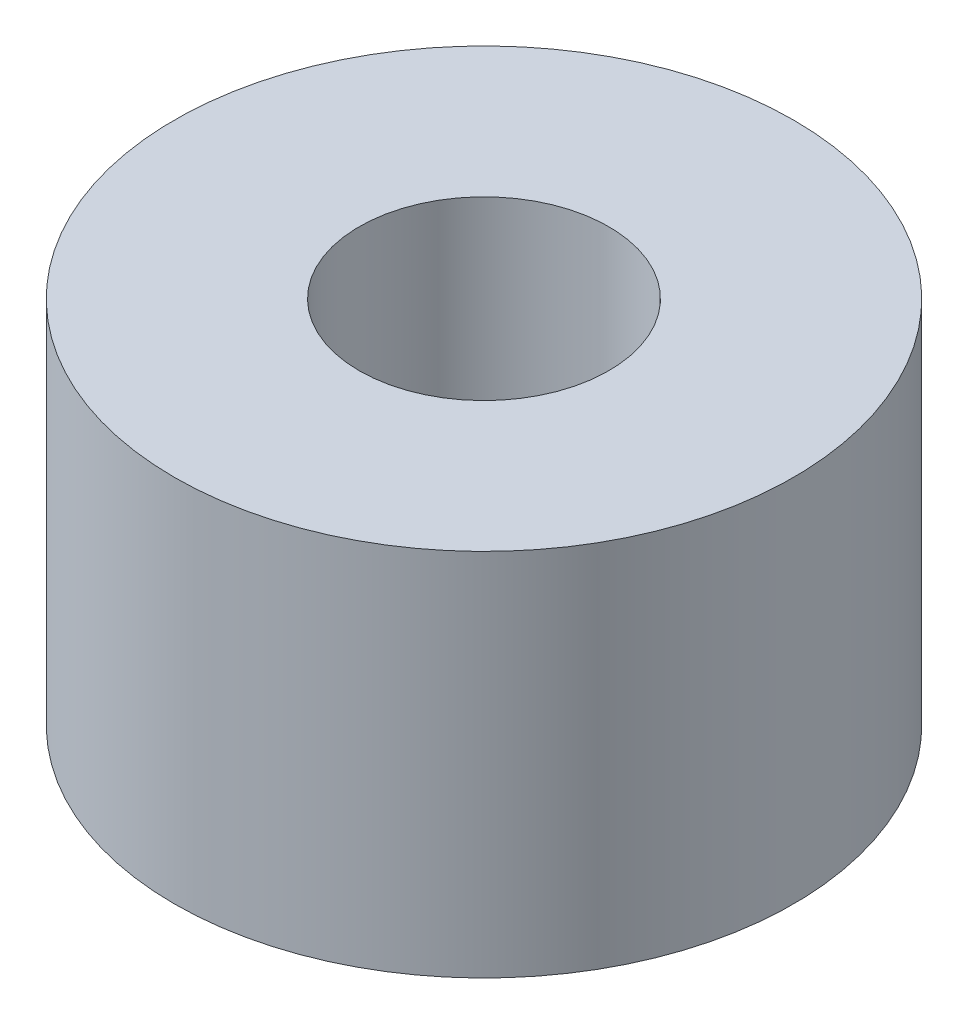
ISO-10303-21;
HEADER;
FILE_DESCRIPTION(('STEP AP214'),'2;1');
FILE_NAME('part.step','',(''),(''),'','','');
FILE_SCHEMA(('AUTOMOTIVE_DESIGN { 1 0 10303 214 1 1 1 1 }'));
ENDSEC;
DATA;
#1=APPLICATION_CONTEXT('core data for automotive mechanical design processes');
#2=APPLICATION_PROTOCOL_DEFINITION('international standard','automotive_design',2000,#1);
#3=PRODUCT_CONTEXT('',#1,'mechanical');
#4=PRODUCT('Part','Part','',(#3));
#5=PRODUCT_RELATED_PRODUCT_CATEGORY('part','',(#4));
#6=PRODUCT_DEFINITION_FORMATION('','',#4);
#7=PRODUCT_DEFINITION_CONTEXT('part definition',#1,'design');
#8=PRODUCT_DEFINITION('design','',#6,#7);
#9=PRODUCT_DEFINITION_SHAPE('','',#8);
#10=(LENGTH_UNIT() NAMED_UNIT(*) SI_UNIT(.MILLI.,.METRE.));
#11=(NAMED_UNIT(*) PLANE_ANGLE_UNIT() SI_UNIT($,.RADIAN.));
#12=(NAMED_UNIT(*) SI_UNIT($,.STERADIAN.) SOLID_ANGLE_UNIT());
#13=UNCERTAINTY_MEASURE_WITH_UNIT(LENGTH_MEASURE(1.E-05),#10,'distance_accuracy_value','');
#14=(GEOMETRIC_REPRESENTATION_CONTEXT(3) GLOBAL_UNCERTAINTY_ASSIGNED_CONTEXT((#13)) GLOBAL_UNIT_ASSIGNED_CONTEXT((#10,
#11,#12)) REPRESENTATION_CONTEXT('',''));
#15=CARTESIAN_POINT('',(0.,0.,0.));
#16=DIRECTION('',(0.,0.,1.));
#17=DIRECTION('',(1.,0.,0.));
#18=AXIS2_PLACEMENT_3D('',#15,#16,#17);
#19=CARTESIAN_POINT('',(0.,10.,0.));
#20=DIRECTION('',(0.,1.,0.));
#21=DIRECTION('',(0.,0.,1.));
#22=AXIS2_PLACEMENT_3D('',#19,#20,#21);
#23=PLANE('',#22);
#24=CARTESIAN_POINT('',(0.,10.,0.));
#25=DIRECTION('',(0.,1.,0.));
#26=DIRECTION('',(0.,0.,1.));
#27=AXIS2_PLACEMENT_3D('',#24,#25,#26);
#28=CIRCLE('',#27,8.3782);
#29=CARTESIAN_POINT('',(0.,10.,8.3782));
#30=VERTEX_POINT('',#29);
#31=EDGE_CURVE('E10',#30,#30,#28,.T.);
#32=ORIENTED_EDGE('',*,*,#31,.T.);
#33=EDGE_LOOP('',(#32));
#34=FACE_BOUND('',#33,.T.);
#35=CARTESIAN_POINT('',(0.,10.,0.));
#36=DIRECTION('',(0.,1.,0.));
#37=DIRECTION('',(0.,0.,1.));
#38=AXIS2_PLACEMENT_3D('',#35,#36,#37);
#39=CIRCLE('',#38,3.3782);
#40=CARTESIAN_POINT('',(0.,10.,3.3782));
#41=VERTEX_POINT('',#40);
#42=EDGE_CURVE('E54',#41,#41,#39,.T.);
#43=ORIENTED_EDGE('',*,*,#42,.F.);
#44=EDGE_LOOP('',(#43));
#45=FACE_BOUND('',#44,.T.);
#46=ADVANCED_FACE('F41',(#34,#45),#23,.T.);
#47=CARTESIAN_POINT('',(0.,0.,0.));
#48=DIRECTION('',(0.,1.,0.));
#49=DIRECTION('',(0.,0.,1.));
#50=AXIS2_PLACEMENT_3D('',#47,#48,#49);
#51=PLANE('',#50);
#52=CARTESIAN_POINT('',(0.,0.,0.));
#53=DIRECTION('',(0.,1.,0.));
#54=DIRECTION('',(0.,0.,1.));
#55=AXIS2_PLACEMENT_3D('',#52,#53,#54);
#56=CIRCLE('',#55,8.3782);
#57=CARTESIAN_POINT('',(0.,0.,8.3782));
#58=VERTEX_POINT('',#57);
#59=EDGE_CURVE('E45',#58,#58,#56,.T.);
#60=ORIENTED_EDGE('',*,*,#59,.F.);
#61=EDGE_LOOP('',(#60));
#62=FACE_BOUND('',#61,.T.);
#63=CARTESIAN_POINT('',(0.,0.,0.));
#64=DIRECTION('',(0.,1.,0.));
#65=DIRECTION('',(0.,0.,1.));
#66=AXIS2_PLACEMENT_3D('',#63,#64,#65);
#67=CIRCLE('',#66,3.3782);
#68=CARTESIAN_POINT('',(0.,0.,3.3782));
#69=VERTEX_POINT('',#68);
#70=EDGE_CURVE('E56',#69,#69,#67,.T.);
#71=ORIENTED_EDGE('',*,*,#70,.T.);
#72=EDGE_LOOP('',(#71));
#73=FACE_BOUND('',#72,.T.);
#74=ADVANCED_FACE('F68',(#62,#73),#51,.F.);
#75=CARTESIAN_POINT('',(0.,10.,0.));
#76=DIRECTION('',(0.,-1.,0.));
#77=DIRECTION('',(0.,0.,-1.));
#78=AXIS2_PLACEMENT_3D('',#75,#76,#77);
#79=CYLINDRICAL_SURFACE('',#78,8.3782);
#80=ORIENTED_EDGE('',*,*,#31,.F.);
#81=EDGE_LOOP('',(#80));
#82=FACE_BOUND('',#81,.T.);
#83=ORIENTED_EDGE('',*,*,#59,.T.);
#84=EDGE_LOOP('',(#83));
#85=FACE_BOUND('',#84,.T.);
#86=ADVANCED_FACE('F43',(#82,#85),#79,.T.);
#87=CARTESIAN_POINT('',(0.,10.,0.));
#88=DIRECTION('',(0.,-1.,0.));
#89=DIRECTION('',(0.,0.,-1.));
#90=AXIS2_PLACEMENT_3D('',#87,#88,#89);
#91=CYLINDRICAL_SURFACE('',#90,3.3782);
#92=ORIENTED_EDGE('',*,*,#42,.T.);
#93=EDGE_LOOP('',(#92));
#94=FACE_BOUND('',#93,.T.);
#95=ORIENTED_EDGE('',*,*,#70,.F.);
#96=EDGE_LOOP('',(#95));
#97=FACE_BOUND('',#96,.T.);
#98=ADVANCED_FACE('F64',(#94,#97),#91,.F.);
#99=CLOSED_SHELL('',(#46,#74,#86,#98));
#100=MANIFOLD_SOLID_BREP('B2',#99);
#101=ADVANCED_BREP_SHAPE_REPRESENTATION('',(#18,#100),#14);
#102=SHAPE_DEFINITION_REPRESENTATION(#9,#101);
ENDSEC;
END-ISO-10303-21;
